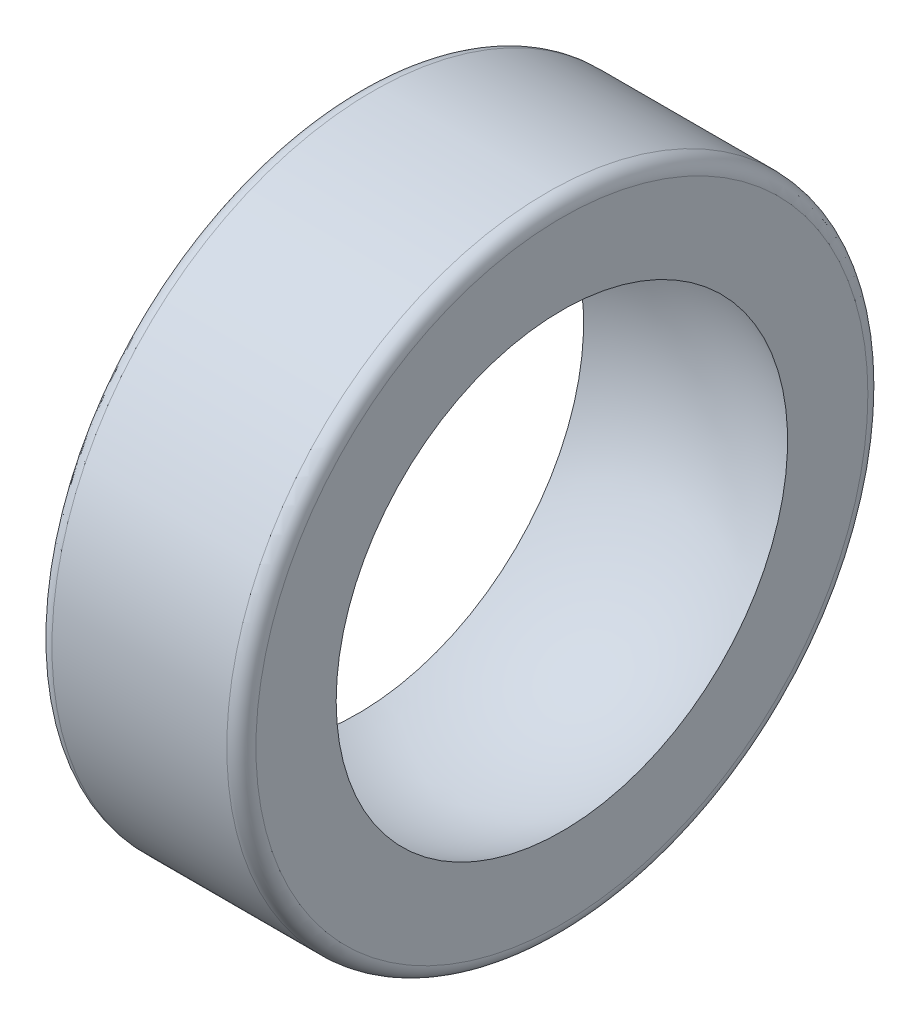
ISO-10303-21;
HEADER;
FILE_DESCRIPTION(('STEP AP214'),'2;1');
FILE_NAME('part.step','',(''),(''),'','','');
FILE_SCHEMA(('AUTOMOTIVE_DESIGN { 1 0 10303 214 1 1 1 1 }'));
ENDSEC;
DATA;
#1=APPLICATION_CONTEXT('core data for automotive mechanical design processes');
#2=APPLICATION_PROTOCOL_DEFINITION('international standard','automotive_design',2000,#1);
#3=PRODUCT_CONTEXT('',#1,'mechanical');
#4=PRODUCT('Part','Part','',(#3));
#5=PRODUCT_RELATED_PRODUCT_CATEGORY('part','',(#4));
#6=PRODUCT_DEFINITION_FORMATION('','',#4);
#7=PRODUCT_DEFINITION_CONTEXT('part definition',#1,'design');
#8=PRODUCT_DEFINITION('design','',#6,#7);
#9=PRODUCT_DEFINITION_SHAPE('','',#8);
#10=(LENGTH_UNIT() NAMED_UNIT(*) SI_UNIT(.MILLI.,.METRE.));
#11=(NAMED_UNIT(*) PLANE_ANGLE_UNIT() SI_UNIT($,.RADIAN.));
#12=(NAMED_UNIT(*) SI_UNIT($,.STERADIAN.) SOLID_ANGLE_UNIT());
#13=UNCERTAINTY_MEASURE_WITH_UNIT(LENGTH_MEASURE(1.E-05),#10,'distance_accuracy_value','');
#14=(GEOMETRIC_REPRESENTATION_CONTEXT(3) GLOBAL_UNCERTAINTY_ASSIGNED_CONTEXT((#13)) GLOBAL_UNIT_ASSIGNED_CONTEXT((#10,
#11,#12)) REPRESENTATION_CONTEXT('',''));
#15=CARTESIAN_POINT('',(0.,0.,0.));
#16=DIRECTION('',(0.,0.,1.));
#17=DIRECTION('',(1.,0.,0.));
#18=AXIS2_PLACEMENT_3D('',#15,#16,#17);
#19=CARTESIAN_POINT('',(0.,0.,0.));
#20=DIRECTION('',(0.,0.,1.));
#21=DIRECTION('',(1.,0.,0.));
#22=AXIS2_PLACEMENT_3D('',#19,#20,#21);
#23=SPHERICAL_SURFACE('',#22,8.5);
#24=CARTESIAN_POINT('',(0.,0.,0.));
#25=DIRECTION('',(-1.,0.,0.));
#26=DIRECTION('',(0.,0.,1.));
#27=AXIS2_PLACEMENT_3D('',#24,#25,#26);
#28=SPHERICAL_SURFACE('',#27,8.5);
#29=CARTESIAN_POINT('',(-3.5,0.,0.));
#30=DIRECTION('',(-1.,0.,0.));
#31=DIRECTION('',(0.,0.,1.));
#32=AXIS2_PLACEMENT_3D('',#29,#30,#31);
#33=CIRCLE('',#32,7.74596669241484);
#34=CARTESIAN_POINT('',(-3.5,0.,7.74596669241484));
#35=VERTEX_POINT('',#34);
#36=EDGE_CURVE('E56',#35,#35,#33,.T.);
#37=ORIENTED_EDGE('',*,*,#36,.T.);
#38=EDGE_LOOP('',(#37));
#39=FACE_BOUND('',#38,.T.);
#40=CARTESIAN_POINT('',(3.5,0.,0.));
#41=DIRECTION('',(-1.,0.,0.));
#42=DIRECTION('',(0.,0.,1.));
#43=AXIS2_PLACEMENT_3D('',#40,#41,#42);
#44=CIRCLE('',#43,7.74596669241483);
#45=CARTESIAN_POINT('',(3.5,0.,7.74596669241483));
#46=VERTEX_POINT('',#45);
#47=EDGE_CURVE('E53',#46,#46,#44,.T.);
#48=ORIENTED_EDGE('',*,*,#47,.F.);
#49=EDGE_LOOP('',(#48));
#50=FACE_BOUND('',#49,.T.);
#51=ADVANCED_FACE('F34',(#39,#50),#28,.F.);
#52=CARTESIAN_POINT('',(3.5,11.,0.));
#53=DIRECTION('',(1.,0.,0.));
#54=DIRECTION('',(0.,0.,-1.));
#55=AXIS2_PLACEMENT_3D('',#52,#53,#54);
#56=PLANE('',#55);
#57=CARTESIAN_POINT('',(3.5,0.,0.));
#58=DIRECTION('',(1.,0.,0.));
#59=DIRECTION('',(0.,0.,-1.));
#60=AXIS2_PLACEMENT_3D('',#57,#58,#59);
#61=CIRCLE('',#60,10.5);
#62=CARTESIAN_POINT('',(3.5,0.,-10.5));
#63=VERTEX_POINT('',#62);
#64=EDGE_CURVE('E40',#63,#63,#61,.T.);
#65=ORIENTED_EDGE('',*,*,#64,.T.);
#66=EDGE_LOOP('',(#65));
#67=FACE_BOUND('',#66,.T.);
#68=ORIENTED_EDGE('',*,*,#47,.T.);
#69=EDGE_LOOP('',(#68));
#70=FACE_BOUND('',#69,.T.);
#71=ADVANCED_FACE('F74',(#67,#70),#56,.T.);
#72=CARTESIAN_POINT('',(-60.,0.,0.));
#73=DIRECTION('',(-1.,0.,0.));
#74=DIRECTION('',(0.,0.,1.));
#75=AXIS2_PLACEMENT_3D('',#72,#73,#74);
#76=CYLINDRICAL_SURFACE('',#75,11.);
#77=CARTESIAN_POINT('',(3.,0.,0.));
#78=DIRECTION('',(1.,0.,0.));
#79=DIRECTION('',(0.,0.,-1.));
#80=AXIS2_PLACEMENT_3D('',#77,#78,#79);
#81=CIRCLE('',#80,11.);
#82=CARTESIAN_POINT('',(3.,0.,-11.));
#83=VERTEX_POINT('',#82);
#84=EDGE_CURVE('E44',#83,#83,#81,.F.);
#85=ORIENTED_EDGE('',*,*,#84,.T.);
#86=EDGE_LOOP('',(#85));
#87=FACE_BOUND('',#86,.T.);
#88=CARTESIAN_POINT('',(-3.,0.,0.));
#89=DIRECTION('',(1.,0.,0.));
#90=DIRECTION('',(0.,0.,-1.));
#91=AXIS2_PLACEMENT_3D('',#88,#89,#90);
#92=CIRCLE('',#91,11.);
#93=CARTESIAN_POINT('',(-3.,0.,-11.));
#94=VERTEX_POINT('',#93);
#95=EDGE_CURVE('E48',#94,#94,#92,.T.);
#96=ORIENTED_EDGE('',*,*,#95,.T.);
#97=EDGE_LOOP('',(#96));
#98=FACE_BOUND('',#97,.T.);
#99=ADVANCED_FACE('F65',(#87,#98),#76,.T.);
#100=CARTESIAN_POINT('',(-3.5,11.,0.));
#101=DIRECTION('',(1.,0.,0.));
#102=DIRECTION('',(0.,0.,-1.));
#103=AXIS2_PLACEMENT_3D('',#100,#101,#102);
#104=PLANE('',#103);
#105=CARTESIAN_POINT('',(-3.5,0.,0.));
#106=DIRECTION('',(1.,0.,0.));
#107=DIRECTION('',(0.,0.,-1.));
#108=AXIS2_PLACEMENT_3D('',#105,#106,#107);
#109=CIRCLE('',#108,10.5);
#110=CARTESIAN_POINT('',(-3.5,0.,-10.5));
#111=VERTEX_POINT('',#110);
#112=EDGE_CURVE('E10',#111,#111,#109,.F.);
#113=ORIENTED_EDGE('',*,*,#112,.T.);
#114=EDGE_LOOP('',(#113));
#115=FACE_BOUND('',#114,.T.);
#116=ORIENTED_EDGE('',*,*,#36,.F.);
#117=EDGE_LOOP('',(#116));
#118=FACE_BOUND('',#117,.T.);
#119=ADVANCED_FACE('F62',(#115,#118),#104,.F.);
#120=CARTESIAN_POINT('',(3.,0.,0.));
#121=DIRECTION('',(1.,0.,0.));
#122=DIRECTION('',(0.,0.,-1.));
#123=AXIS2_PLACEMENT_3D('',#120,#121,#122);
#124=TOROIDAL_SURFACE('',#123,10.5,0.5);
#125=ORIENTED_EDGE('',*,*,#64,.F.);
#126=EDGE_LOOP('',(#125));
#127=FACE_BOUND('',#126,.T.);
#128=ORIENTED_EDGE('',*,*,#84,.F.);
#129=EDGE_LOOP('',(#128));
#130=FACE_BOUND('',#129,.T.);
#131=ADVANCED_FACE('F64',(#127,#130),#124,.T.);
#132=CARTESIAN_POINT('',(-3.,0.,0.));
#133=DIRECTION('',(1.,0.,0.));
#134=DIRECTION('',(0.,0.,-1.));
#135=AXIS2_PLACEMENT_3D('',#132,#133,#134);
#136=TOROIDAL_SURFACE('',#135,10.5,0.5);
#137=ORIENTED_EDGE('',*,*,#95,.F.);
#138=EDGE_LOOP('',(#137));
#139=FACE_BOUND('',#138,.T.);
#140=ORIENTED_EDGE('',*,*,#112,.F.);
#141=EDGE_LOOP('',(#140));
#142=FACE_BOUND('',#141,.T.);
#143=ADVANCED_FACE('F71',(#139,#142),#136,.T.);
#144=CLOSED_SHELL('',(#51,#71,#99,#119,#131,#143));
#145=MANIFOLD_SOLID_BREP('B2',#144);
#146=ADVANCED_BREP_SHAPE_REPRESENTATION('',(#18,#145),#14);
#147=SHAPE_DEFINITION_REPRESENTATION(#9,#146);
ENDSEC;
END-ISO-10303-21;
